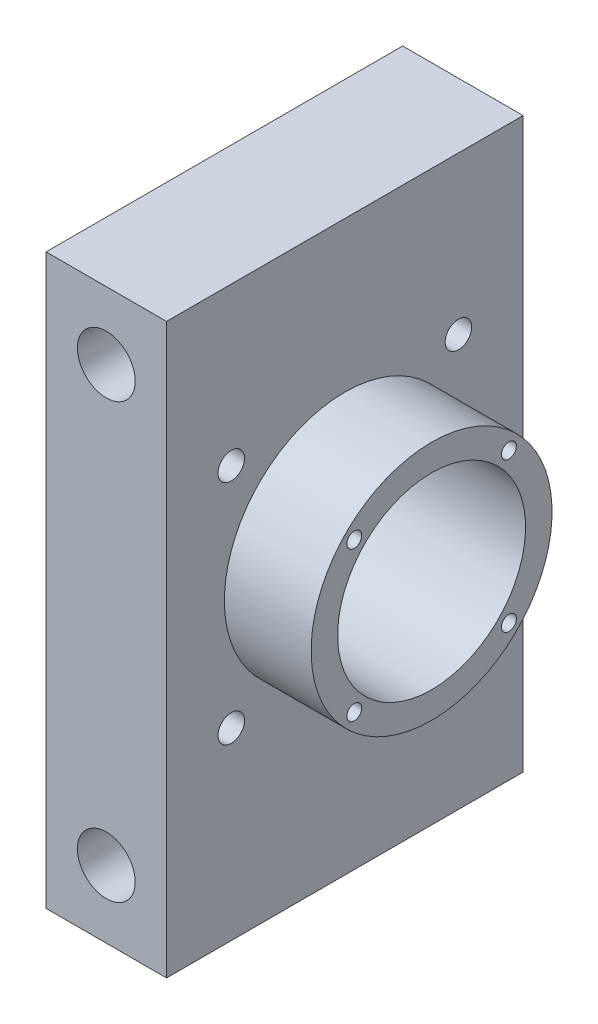
ISO-10303-21;
HEADER;
FILE_DESCRIPTION(('STEP AP214'),'2;1');
FILE_NAME('part.step','',(''),(''),'','','');
FILE_SCHEMA(('AUTOMOTIVE_DESIGN { 1 0 10303 214 1 1 1 1 }'));
ENDSEC;
DATA;
#1=APPLICATION_CONTEXT('core data for automotive mechanical design processes');
#2=APPLICATION_PROTOCOL_DEFINITION('international standard','automotive_design',2000,#1);
#3=PRODUCT_CONTEXT('',#1,'mechanical');
#4=PRODUCT('Part','Part','',(#3));
#5=PRODUCT_RELATED_PRODUCT_CATEGORY('part','',(#4));
#6=PRODUCT_DEFINITION_FORMATION('','',#4);
#7=PRODUCT_DEFINITION_CONTEXT('part definition',#1,'design');
#8=PRODUCT_DEFINITION('design','',#6,#7);
#9=PRODUCT_DEFINITION_SHAPE('','',#8);
#10=(LENGTH_UNIT() NAMED_UNIT(*) SI_UNIT(.MILLI.,.METRE.));
#11=(NAMED_UNIT(*) PLANE_ANGLE_UNIT() SI_UNIT($,.RADIAN.));
#12=(NAMED_UNIT(*) SI_UNIT($,.STERADIAN.) SOLID_ANGLE_UNIT());
#13=UNCERTAINTY_MEASURE_WITH_UNIT(LENGTH_MEASURE(1.E-05),#10,'distance_accuracy_value','');
#14=(GEOMETRIC_REPRESENTATION_CONTEXT(3) GLOBAL_UNCERTAINTY_ASSIGNED_CONTEXT((#13)) GLOBAL_UNIT_ASSIGNED_CONTEXT((#10,
#11,#12)) REPRESENTATION_CONTEXT('',''));
#15=CARTESIAN_POINT('',(0.,0.,0.));
#16=DIRECTION('',(0.,0.,1.));
#17=DIRECTION('',(1.,0.,0.));
#18=AXIS2_PLACEMENT_3D('',#15,#16,#17);
#19=CARTESIAN_POINT('',(0.,100.,320.));
#20=DIRECTION('',(-1.,0.,0.));
#21=DIRECTION('',(0.,-1.,0.));
#22=AXIS2_PLACEMENT_3D('',#19,#20,#21);
#23=PLANE('',#22);
#24=CARTESIAN_POINT('',(0.,76.3639430257798,-1.43000000000002));
#25=DIRECTION('',(-1.,0.,0.));
#26=DIRECTION('',(0.,-1.,0.));
#27=AXIS2_PLACEMENT_3D('',#24,#25,#26);
#28=CIRCLE('',#27,2.75);
#29=CARTESIAN_POINT('',(0.,73.6139430257798,-1.43000000000002));
#30=VERTEX_POINT('',#29);
#31=EDGE_CURVE('E186',#30,#30,#28,.T.);
#32=ORIENTED_EDGE('',*,*,#31,.T.);
#33=EDGE_LOOP('',(#32));
#34=FACE_BOUND('',#33,.T.);
#35=CARTESIAN_POINT('',(0.,29.2239430257798,-1.43000000000001));
#36=DIRECTION('',(-1.,0.,0.));
#37=DIRECTION('',(0.,-1.,0.));
#38=AXIS2_PLACEMENT_3D('',#35,#36,#37);
#39=CIRCLE('',#38,2.75);
#40=CARTESIAN_POINT('',(0.,26.4739430257798,-1.43000000000001));
#41=VERTEX_POINT('',#40);
#42=EDGE_CURVE('E183',#41,#41,#39,.T.);
#43=ORIENTED_EDGE('',*,*,#42,.T.);
#44=EDGE_LOOP('',(#43));
#45=FACE_BOUND('',#44,.T.);
#46=CARTESIAN_POINT('',(0.,29.2239430257798,-48.57));
#47=DIRECTION('',(-1.,0.,0.));
#48=DIRECTION('',(0.,-1.,0.));
#49=AXIS2_PLACEMENT_3D('',#46,#47,#48);
#50=CIRCLE('',#49,2.75);
#51=CARTESIAN_POINT('',(0.,26.4739430257798,-48.57));
#52=VERTEX_POINT('',#51);
#53=EDGE_CURVE('E180',#52,#52,#50,.T.);
#54=ORIENTED_EDGE('',*,*,#53,.T.);
#55=EDGE_LOOP('',(#54));
#56=FACE_BOUND('',#55,.T.);
#57=CARTESIAN_POINT('',(0.,76.3639430257798,-48.57));
#58=DIRECTION('',(-1.,0.,0.));
#59=DIRECTION('',(0.,-1.,0.));
#60=AXIS2_PLACEMENT_3D('',#57,#58,#59);
#61=CIRCLE('',#60,2.75);
#62=CARTESIAN_POINT('',(0.,73.6139430257798,-48.57));
#63=VERTEX_POINT('',#62);
#64=EDGE_CURVE('E189',#63,#63,#61,.T.);
#65=ORIENTED_EDGE('',*,*,#64,.T.);
#66=EDGE_LOOP('',(#65));
#67=FACE_BOUND('',#66,.T.);
#68=DIRECTION('',(0.,0.,1.));
#69=VECTOR('',#68,1.);
#70=CARTESIAN_POINT('',(0.,-9.00000000000001,-75.3179778023445));
#71=LINE('',#70,#69);
#72=CARTESIAN_POINT('',(0.,-9.00000000000001,-62.));
#73=VERTEX_POINT('',#72);
#74=CARTESIAN_POINT('',(0.,-9.,12.));
#75=VERTEX_POINT('',#74);
#76=EDGE_CURVE('E230',#73,#75,#71,.T.);
#77=ORIENTED_EDGE('',*,*,#76,.F.);
#78=DIRECTION('',(0.,1.,0.));
#79=VECTOR('',#78,1.);
#80=CARTESIAN_POINT('',(0.,109.,-62.));
#81=LINE('',#80,#79);
#82=CARTESIAN_POINT('',(0.,109.,-62.));
#83=VERTEX_POINT('',#82);
#84=EDGE_CURVE('E196',#73,#83,#81,.T.);
#85=ORIENTED_EDGE('',*,*,#84,.T.);
#86=DIRECTION('',(0.,0.,1.));
#87=VECTOR('',#86,1.);
#88=CARTESIAN_POINT('',(0.,109.,-75.3179778023445));
#89=LINE('',#88,#87);
#90=CARTESIAN_POINT('',(0.,109.,12.));
#91=VERTEX_POINT('',#90);
#92=EDGE_CURVE('E62',#83,#91,#89,.T.);
#93=ORIENTED_EDGE('',*,*,#92,.T.);
#94=DIRECTION('',(0.,-1.,0.));
#95=VECTOR('',#94,1.);
#96=CARTESIAN_POINT('',(0.,109.,12.));
#97=LINE('',#96,#95);
#98=EDGE_CURVE('E207',#91,#75,#97,.T.);
#99=ORIENTED_EDGE('',*,*,#98,.T.);
#100=EDGE_LOOP('',(#77,#85,#93,#99));
#101=FACE_BOUND('',#100,.T.);
#102=CARTESIAN_POINT('',(0.,52.7939430257798,-25.));
#103=DIRECTION('',(1.,0.,0.));
#104=DIRECTION('',(0.,1.,0.));
#105=AXIS2_PLACEMENT_3D('',#102,#103,#104);
#106=CIRCLE('',#105,25.);
#107=CARTESIAN_POINT('',(0.,77.7939430257798,-25.));
#108=VERTEX_POINT('',#107);
#109=EDGE_CURVE('E46',#108,#108,#106,.T.);
#110=ORIENTED_EDGE('',*,*,#109,.F.);
#111=EDGE_LOOP('',(#110));
#112=FACE_BOUND('',#111,.T.);
#113=ADVANCED_FACE('F38',(#34,#45,#56,#67,#101,#112),#23,.F.);
#114=CARTESIAN_POINT('',(-25.,100.,320.));
#115=DIRECTION('',(1.,0.,0.));
#116=DIRECTION('',(0.,1.,0.));
#117=AXIS2_PLACEMENT_3D('',#114,#115,#116);
#118=PLANE('',#117);
#119=DIRECTION('',(0.,0.,-1.));
#120=VECTOR('',#119,1.);
#121=CARTESIAN_POINT('',(-25.,81.5439430257798,-53.75));
#122=LINE('',#121,#120);
#123=CARTESIAN_POINT('',(-25.,81.5439430257798,3.75000000000003));
#124=VERTEX_POINT('',#123);
#125=CARTESIAN_POINT('',(-25.,81.5439430257798,-53.75));
#126=VERTEX_POINT('',#125);
#127=EDGE_CURVE('E156',#124,#126,#122,.T.);
#128=ORIENTED_EDGE('',*,*,#127,.F.);
#129=DIRECTION('',(0.,1.,0.));
#130=VECTOR('',#129,1.);
#131=CARTESIAN_POINT('',(-25.,24.0439430257797,3.74999999999999));
#132=LINE('',#131,#130);
#133=CARTESIAN_POINT('',(-25.,24.0439430257797,3.74999999999999));
#134=VERTEX_POINT('',#133);
#135=EDGE_CURVE('E54',#134,#124,#132,.T.);
#136=ORIENTED_EDGE('',*,*,#135,.F.);
#137=DIRECTION('',(0.,0.,1.));
#138=VECTOR('',#137,1.);
#139=CARTESIAN_POINT('',(-25.,24.0439430257797,-53.75));
#140=LINE('',#139,#138);
#141=CARTESIAN_POINT('',(-25.,24.0439430257797,-53.75));
#142=VERTEX_POINT('',#141);
#143=EDGE_CURVE('E113',#142,#134,#140,.T.);
#144=ORIENTED_EDGE('',*,*,#143,.F.);
#145=DIRECTION('',(0.,-1.,0.));
#146=VECTOR('',#145,1.);
#147=CARTESIAN_POINT('',(-25.,24.0439430257797,-53.75));
#148=LINE('',#147,#146);
#149=EDGE_CURVE('E158',#126,#142,#148,.T.);
#150=ORIENTED_EDGE('',*,*,#149,.F.);
#151=EDGE_LOOP('',(#128,#136,#144,#150));
#152=FACE_BOUND('',#151,.T.);
#153=DIRECTION('',(0.,0.,1.));
#154=VECTOR('',#153,1.);
#155=CARTESIAN_POINT('',(-25.0000000000002,-9.00000000000001,-75.3179778023445));
#156=LINE('',#155,#154);
#157=CARTESIAN_POINT('',(-25.,-9.00000000000001,-62.));
#158=VERTEX_POINT('',#157);
#159=CARTESIAN_POINT('',(-25.,-9.00000000000001,12.));
#160=VERTEX_POINT('',#159);
#161=EDGE_CURVE('E229',#158,#160,#156,.T.);
#162=ORIENTED_EDGE('',*,*,#161,.T.);
#163=DIRECTION('',(0.,1.,0.));
#164=VECTOR('',#163,1.);
#165=CARTESIAN_POINT('',(-25.,109.,12.));
#166=LINE('',#165,#164);
#167=CARTESIAN_POINT('',(-25.,109.,12.));
#168=VERTEX_POINT('',#167);
#169=EDGE_CURVE('E198',#160,#168,#166,.T.);
#170=ORIENTED_EDGE('',*,*,#169,.T.);
#171=DIRECTION('',(0.,0.,1.));
#172=VECTOR('',#171,1.);
#173=CARTESIAN_POINT('',(-25.0000000000002,109.,-75.3179778023445));
#174=LINE('',#173,#172);
#175=CARTESIAN_POINT('',(-25.,109.,-62.));
#176=VERTEX_POINT('',#175);
#177=EDGE_CURVE('E233',#176,#168,#174,.T.);
#178=ORIENTED_EDGE('',*,*,#177,.F.);
#179=DIRECTION('',(0.,-1.,0.));
#180=VECTOR('',#179,1.);
#181=CARTESIAN_POINT('',(-25.,109.,-62.));
#182=LINE('',#181,#180);
#183=EDGE_CURVE('E195',#176,#158,#182,.T.);
#184=ORIENTED_EDGE('',*,*,#183,.T.);
#185=EDGE_LOOP('',(#162,#170,#178,#184));
#186=FACE_BOUND('',#185,.T.);
#187=ADVANCED_FACE('F242',(#152,#186),#118,.F.);
#188=CARTESIAN_POINT('',(18.,52.7939430257798,-25.));
#189=DIRECTION('',(1.,0.,0.));
#190=DIRECTION('',(0.,1.,0.));
#191=AXIS2_PLACEMENT_3D('',#188,#189,#190);
#192=PLANE('',#191);
#193=CARTESIAN_POINT('',(18.,52.7939430257798,-25.));
#194=DIRECTION('',(-1.,0.,0.));
#195=DIRECTION('',(0.,-1.,0.));
#196=AXIS2_PLACEMENT_3D('',#193,#194,#195);
#197=CIRCLE('',#196,19.5);
#198=CARTESIAN_POINT('',(18.,33.2939430257798,-25.));
#199=VERTEX_POINT('',#198);
#200=EDGE_CURVE('E192',#199,#199,#197,.T.);
#201=ORIENTED_EDGE('',*,*,#200,.T.);
#202=EDGE_LOOP('',(#201));
#203=FACE_BOUND('',#202,.T.);
#204=CARTESIAN_POINT('',(18.,68.2939430257798,-8.95466243610082));
#205=DIRECTION('',(-1.,0.,0.));
#206=DIRECTION('',(0.,-1.,0.));
#207=AXIS2_PLACEMENT_3D('',#204,#205,#206);
#208=CIRCLE('',#207,1.55);
#209=CARTESIAN_POINT('',(18.,66.7439430257798,-8.95466243610082));
#210=VERTEX_POINT('',#209);
#211=EDGE_CURVE('E218',#210,#210,#208,.T.);
#212=ORIENTED_EDGE('',*,*,#211,.T.);
#213=EDGE_LOOP('',(#212));
#214=FACE_BOUND('',#213,.T.);
#215=CARTESIAN_POINT('',(18.,37.2939430257798,-8.95466243610082));
#216=DIRECTION('',(-1.,0.,0.));
#217=DIRECTION('',(0.,-1.,0.));
#218=AXIS2_PLACEMENT_3D('',#215,#216,#217);
#219=CIRCLE('',#218,1.55);
#220=CARTESIAN_POINT('',(18.,35.7439430257798,-8.95466243610082));
#221=VERTEX_POINT('',#220);
#222=EDGE_CURVE('E222',#221,#221,#219,.T.);
#223=ORIENTED_EDGE('',*,*,#222,.T.);
#224=EDGE_LOOP('',(#223));
#225=FACE_BOUND('',#224,.T.);
#226=CARTESIAN_POINT('',(18.,37.2939430257798,-41.0453375638992));
#227=DIRECTION('',(-1.,0.,0.));
#228=DIRECTION('',(0.,-1.,0.));
#229=AXIS2_PLACEMENT_3D('',#226,#227,#228);
#230=CIRCLE('',#229,1.55);
#231=CARTESIAN_POINT('',(18.,35.7439430257798,-41.0453375638992));
#232=VERTEX_POINT('',#231);
#233=EDGE_CURVE('E209',#232,#232,#230,.T.);
#234=ORIENTED_EDGE('',*,*,#233,.T.);
#235=EDGE_LOOP('',(#234));
#236=FACE_BOUND('',#235,.T.);
#237=CARTESIAN_POINT('',(18.,68.2939430257798,-41.0453375638992));
#238=DIRECTION('',(-1.,0.,0.));
#239=DIRECTION('',(0.,-1.,0.));
#240=AXIS2_PLACEMENT_3D('',#237,#238,#239);
#241=CIRCLE('',#240,1.55);
#242=CARTESIAN_POINT('',(18.,66.7439430257798,-41.0453375638992));
#243=VERTEX_POINT('',#242);
#244=EDGE_CURVE('E221',#243,#243,#241,.T.);
#245=ORIENTED_EDGE('',*,*,#244,.T.);
#246=EDGE_LOOP('',(#245));
#247=FACE_BOUND('',#246,.T.);
#248=CARTESIAN_POINT('',(18.,52.7939430257798,-25.));
#249=DIRECTION('',(1.,0.,0.));
#250=DIRECTION('',(0.,1.,0.));
#251=AXIS2_PLACEMENT_3D('',#248,#249,#250);
#252=CIRCLE('',#251,25.);
#253=CARTESIAN_POINT('',(18.,77.7939430257798,-25.));
#254=VERTEX_POINT('',#253);
#255=EDGE_CURVE('E12',#254,#254,#252,.T.);
#256=ORIENTED_EDGE('',*,*,#255,.T.);
#257=EDGE_LOOP('',(#256));
#258=FACE_BOUND('',#257,.T.);
#259=ADVANCED_FACE('F249',(#203,#214,#225,#236,#247,#258),#192,.T.);
#260=CARTESIAN_POINT('',(18.,52.7939430257798,-25.));
#261=DIRECTION('',(-1.,0.,0.));
#262=DIRECTION('',(0.,-1.,0.));
#263=AXIS2_PLACEMENT_3D('',#260,#261,#262);
#264=CYLINDRICAL_SURFACE('',#263,25.);
#265=ORIENTED_EDGE('',*,*,#109,.T.);
#266=EDGE_LOOP('',(#265));
#267=FACE_BOUND('',#266,.T.);
#268=ORIENTED_EDGE('',*,*,#255,.F.);
#269=EDGE_LOOP('',(#268));
#270=FACE_BOUND('',#269,.T.);
#271=ADVANCED_FACE('F238',(#267,#270),#264,.T.);
#272=CARTESIAN_POINT('',(-25.0000000000002,109.,-75.3179778023445));
#273=DIRECTION('',(0.,1.,0.));
#274=DIRECTION('',(0.,0.,1.));
#275=AXIS2_PLACEMENT_3D('',#272,#273,#274);
#276=PLANE('',#275);
#277=ORIENTED_EDGE('',*,*,#92,.F.);
#278=DIRECTION('',(-1.,0.,0.));
#279=VECTOR('',#278,1.);
#280=CARTESIAN_POINT('',(118.608600025462,109.,-62.));
#281=LINE('',#280,#279);
#282=EDGE_CURVE('E202',#83,#176,#281,.T.);
#283=ORIENTED_EDGE('',*,*,#282,.T.);
#284=ORIENTED_EDGE('',*,*,#177,.T.);
#285=DIRECTION('',(-1.,0.,0.));
#286=VECTOR('',#285,1.);
#287=CARTESIAN_POINT('',(118.608600025462,109.,12.));
#288=LINE('',#287,#286);
#289=EDGE_CURVE('E210',#91,#168,#288,.T.);
#290=ORIENTED_EDGE('',*,*,#289,.F.);
#291=EDGE_LOOP('',(#277,#283,#284,#290));
#292=FACE_BOUND('',#291,.T.);
#293=ADVANCED_FACE('F271',(#292),#276,.T.);
#294=CARTESIAN_POINT('',(-25.0000000000002,-9.00000000000001,-75.3179778023445));
#295=DIRECTION('',(0.,-1.,0.));
#296=DIRECTION('',(0.,0.,-1.));
#297=AXIS2_PLACEMENT_3D('',#294,#295,#296);
#298=PLANE('',#297);
#299=ORIENTED_EDGE('',*,*,#161,.F.);
#300=DIRECTION('',(-1.,0.,0.));
#301=VECTOR('',#300,1.);
#302=CARTESIAN_POINT('',(118.608600025462,-9.,-62.));
#303=LINE('',#302,#301);
#304=EDGE_CURVE('E199',#73,#158,#303,.T.);
#305=ORIENTED_EDGE('',*,*,#304,.F.);
#306=ORIENTED_EDGE('',*,*,#76,.T.);
#307=DIRECTION('',(-1.,0.,0.));
#308=VECTOR('',#307,1.);
#309=CARTESIAN_POINT('',(118.608600025462,-8.99999999999999,12.));
#310=LINE('',#309,#308);
#311=EDGE_CURVE('E213',#75,#160,#310,.T.);
#312=ORIENTED_EDGE('',*,*,#311,.T.);
#313=EDGE_LOOP('',(#299,#305,#306,#312));
#314=FACE_BOUND('',#313,.T.);
#315=ADVANCED_FACE('F266',(#314),#298,.T.);
#316=CARTESIAN_POINT('',(18.,68.2939430257798,-41.0453375638992));
#317=DIRECTION('',(-1.,0.,0.));
#318=DIRECTION('',(0.,-1.,0.));
#319=AXIS2_PLACEMENT_3D('',#316,#317,#318);
#320=CYLINDRICAL_SURFACE('',#319,1.55);
#321=CARTESIAN_POINT('',(-9.99999999999999,68.2939430257798,-41.0453375638992));
#322=DIRECTION('',(1.,0.,0.));
#323=DIRECTION('',(0.,1.,0.));
#324=AXIS2_PLACEMENT_3D('',#321,#322,#323);
#325=CIRCLE('',#324,1.55);
#326=CARTESIAN_POINT('',(-9.99999999999999,69.8439430257798,-41.0453375638992));
#327=VERTEX_POINT('',#326);
#328=EDGE_CURVE('E152',#327,#327,#325,.F.);
#329=ORIENTED_EDGE('',*,*,#328,.T.);
#330=EDGE_LOOP('',(#329));
#331=FACE_BOUND('',#330,.T.);
#332=ORIENTED_EDGE('',*,*,#244,.F.);
#333=EDGE_LOOP('',(#332));
#334=FACE_BOUND('',#333,.T.);
#335=ADVANCED_FACE('F307',(#331,#334),#320,.F.);
#336=CARTESIAN_POINT('',(18.,37.2939430257798,-41.0453375638992));
#337=DIRECTION('',(-1.,0.,0.));
#338=DIRECTION('',(0.,-1.,0.));
#339=AXIS2_PLACEMENT_3D('',#336,#337,#338);
#340=CYLINDRICAL_SURFACE('',#339,1.55);
#341=CARTESIAN_POINT('',(-9.99999999999999,37.2939430257798,-41.0453375638992));
#342=DIRECTION('',(1.,0.,0.));
#343=DIRECTION('',(0.,1.,0.));
#344=AXIS2_PLACEMENT_3D('',#341,#342,#343);
#345=CIRCLE('',#344,1.55);
#346=CARTESIAN_POINT('',(-9.99999999999999,38.8439430257798,-41.0453375638992));
#347=VERTEX_POINT('',#346);
#348=EDGE_CURVE('E149',#347,#347,#345,.F.);
#349=ORIENTED_EDGE('',*,*,#348,.T.);
#350=EDGE_LOOP('',(#349));
#351=FACE_BOUND('',#350,.T.);
#352=ORIENTED_EDGE('',*,*,#233,.F.);
#353=EDGE_LOOP('',(#352));
#354=FACE_BOUND('',#353,.T.);
#355=ADVANCED_FACE('F303',(#351,#354),#340,.F.);
#356=CARTESIAN_POINT('',(18.,37.2939430257798,-8.95466243610082));
#357=DIRECTION('',(-1.,0.,0.));
#358=DIRECTION('',(0.,-1.,0.));
#359=AXIS2_PLACEMENT_3D('',#356,#357,#358);
#360=CYLINDRICAL_SURFACE('',#359,1.55);
#361=CARTESIAN_POINT('',(-9.99999999999999,37.2939430257798,-8.95466243610082));
#362=DIRECTION('',(1.,0.,0.));
#363=DIRECTION('',(0.,1.,0.));
#364=AXIS2_PLACEMENT_3D('',#361,#362,#363);
#365=CIRCLE('',#364,1.55);
#366=CARTESIAN_POINT('',(-9.99999999999999,38.8439430257798,-8.95466243610082));
#367=VERTEX_POINT('',#366);
#368=EDGE_CURVE('E146',#367,#367,#365,.F.);
#369=ORIENTED_EDGE('',*,*,#368,.T.);
#370=EDGE_LOOP('',(#369));
#371=FACE_BOUND('',#370,.T.);
#372=ORIENTED_EDGE('',*,*,#222,.F.);
#373=EDGE_LOOP('',(#372));
#374=FACE_BOUND('',#373,.T.);
#375=ADVANCED_FACE('F285',(#371,#374),#360,.F.);
#376=CARTESIAN_POINT('',(18.,68.2939430257798,-8.95466243610082));
#377=DIRECTION('',(-1.,0.,0.));
#378=DIRECTION('',(0.,-1.,0.));
#379=AXIS2_PLACEMENT_3D('',#376,#377,#378);
#380=CYLINDRICAL_SURFACE('',#379,1.55);
#381=CARTESIAN_POINT('',(-9.99999999999999,68.2939430257798,-8.95466243610082));
#382=DIRECTION('',(1.,0.,0.));
#383=DIRECTION('',(0.,1.,0.));
#384=AXIS2_PLACEMENT_3D('',#381,#382,#383);
#385=CIRCLE('',#384,1.55);
#386=CARTESIAN_POINT('',(-9.99999999999999,69.8439430257798,-8.95466243610082));
#387=VERTEX_POINT('',#386);
#388=EDGE_CURVE('E143',#387,#387,#385,.F.);
#389=ORIENTED_EDGE('',*,*,#388,.T.);
#390=EDGE_LOOP('',(#389));
#391=FACE_BOUND('',#390,.T.);
#392=ORIENTED_EDGE('',*,*,#211,.F.);
#393=EDGE_LOOP('',(#392));
#394=FACE_BOUND('',#393,.T.);
#395=ADVANCED_FACE('F275',(#391,#394),#380,.F.);
#396=CARTESIAN_POINT('',(118.608600025462,109.,12.));
#397=DIRECTION('',(0.,0.,1.));
#398=DIRECTION('',(0.,-1.,0.));
#399=AXIS2_PLACEMENT_3D('',#396,#397,#398);
#400=PLANE('',#399);
#401=CARTESIAN_POINT('',(-12.5,5.,12.));
#402=DIRECTION('',(0.,0.,1.));
#403=DIRECTION('',(0.,-1.,0.));
#404=AXIS2_PLACEMENT_3D('',#401,#402,#403);
#405=CIRCLE('',#404,6.);
#406=CARTESIAN_POINT('',(-12.5,-1.,12.));
#407=VERTEX_POINT('',#406);
#408=EDGE_CURVE('E171',#407,#407,#405,.T.);
#409=ORIENTED_EDGE('',*,*,#408,.F.);
#410=EDGE_LOOP('',(#409));
#411=FACE_BOUND('',#410,.T.);
#412=CARTESIAN_POINT('',(-12.5,95.,12.));
#413=DIRECTION('',(0.,0.,1.));
#414=DIRECTION('',(0.,-1.,0.));
#415=AXIS2_PLACEMENT_3D('',#412,#413,#414);
#416=CIRCLE('',#415,6.);
#417=CARTESIAN_POINT('',(-12.5,89.,12.));
#418=VERTEX_POINT('',#417);
#419=EDGE_CURVE('E177',#418,#418,#416,.T.);
#420=ORIENTED_EDGE('',*,*,#419,.F.);
#421=EDGE_LOOP('',(#420));
#422=FACE_BOUND('',#421,.T.);
#423=ORIENTED_EDGE('',*,*,#98,.F.);
#424=ORIENTED_EDGE('',*,*,#289,.T.);
#425=ORIENTED_EDGE('',*,*,#169,.F.);
#426=ORIENTED_EDGE('',*,*,#311,.F.);
#427=EDGE_LOOP('',(#423,#424,#425,#426));
#428=FACE_BOUND('',#427,.T.);
#429=ADVANCED_FACE('F273',(#411,#422,#428),#400,.T.);
#430=CARTESIAN_POINT('',(118.608600025462,109.,-62.));
#431=DIRECTION('',(0.,0.,-1.));
#432=DIRECTION('',(0.,1.,0.));
#433=AXIS2_PLACEMENT_3D('',#430,#431,#432);
#434=PLANE('',#433);
#435=CARTESIAN_POINT('',(-12.5,5.,-62.));
#436=DIRECTION('',(0.,0.,1.));
#437=DIRECTION('',(1.,0.,0.));
#438=AXIS2_PLACEMENT_3D('',#435,#436,#437);
#439=CIRCLE('',#438,6.);
#440=CARTESIAN_POINT('',(-6.49999999999999,5.,-62.));
#441=VERTEX_POINT('',#440);
#442=EDGE_CURVE('E165',#441,#441,#439,.T.);
#443=ORIENTED_EDGE('',*,*,#442,.T.);
#444=EDGE_LOOP('',(#443));
#445=FACE_BOUND('',#444,.T.);
#446=CARTESIAN_POINT('',(-12.5,95.,-62.));
#447=DIRECTION('',(0.,0.,1.));
#448=DIRECTION('',(1.,0.,0.));
#449=AXIS2_PLACEMENT_3D('',#446,#447,#448);
#450=CIRCLE('',#449,6.);
#451=CARTESIAN_POINT('',(-6.5,95.,-62.));
#452=VERTEX_POINT('',#451);
#453=EDGE_CURVE('E174',#452,#452,#450,.T.);
#454=ORIENTED_EDGE('',*,*,#453,.T.);
#455=EDGE_LOOP('',(#454));
#456=FACE_BOUND('',#455,.T.);
#457=ORIENTED_EDGE('',*,*,#84,.F.);
#458=ORIENTED_EDGE('',*,*,#304,.T.);
#459=ORIENTED_EDGE('',*,*,#183,.F.);
#460=ORIENTED_EDGE('',*,*,#282,.F.);
#461=EDGE_LOOP('',(#457,#458,#459,#460));
#462=FACE_BOUND('',#461,.T.);
#463=ADVANCED_FACE('F264',(#445,#456,#462),#434,.T.);
#464=CARTESIAN_POINT('',(18.,52.7939430257798,-25.));
#465=DIRECTION('',(-1.,0.,0.));
#466=DIRECTION('',(0.,-1.,0.));
#467=AXIS2_PLACEMENT_3D('',#464,#465,#466);
#468=CYLINDRICAL_SURFACE('',#467,19.5);
#469=CARTESIAN_POINT('',(-9.99999999999999,52.7939430257798,-25.));
#470=DIRECTION('',(1.,0.,0.));
#471=DIRECTION('',(0.,1.,0.));
#472=AXIS2_PLACEMENT_3D('',#469,#470,#471);
#473=CIRCLE('',#472,19.5);
#474=CARTESIAN_POINT('',(-9.99999999999999,72.2939430257798,-25.));
#475=VERTEX_POINT('',#474);
#476=EDGE_CURVE('E140',#475,#475,#473,.F.);
#477=ORIENTED_EDGE('',*,*,#476,.T.);
#478=EDGE_LOOP('',(#477));
#479=FACE_BOUND('',#478,.T.);
#480=ORIENTED_EDGE('',*,*,#200,.F.);
#481=EDGE_LOOP('',(#480));
#482=FACE_BOUND('',#481,.T.);
#483=ADVANCED_FACE('F281',(#479,#482),#468,.F.);
#484=CARTESIAN_POINT('',(18.,76.3639430257798,-48.57));
#485=DIRECTION('',(-1.,0.,0.));
#486=DIRECTION('',(0.,-1.,0.));
#487=AXIS2_PLACEMENT_3D('',#484,#485,#486);
#488=CYLINDRICAL_SURFACE('',#487,2.75);
#489=CARTESIAN_POINT('',(-9.99999999999999,76.3639430257798,-48.57));
#490=DIRECTION('',(1.,0.,0.));
#491=DIRECTION('',(0.,1.,0.));
#492=AXIS2_PLACEMENT_3D('',#489,#490,#491);
#493=CIRCLE('',#492,2.75);
#494=CARTESIAN_POINT('',(-9.99999999999999,79.1139430257798,-48.57));
#495=VERTEX_POINT('',#494);
#496=EDGE_CURVE('E137',#495,#495,#493,.F.);
#497=ORIENTED_EDGE('',*,*,#496,.T.);
#498=EDGE_LOOP('',(#497));
#499=FACE_BOUND('',#498,.T.);
#500=ORIENTED_EDGE('',*,*,#64,.F.);
#501=EDGE_LOOP('',(#500));
#502=FACE_BOUND('',#501,.T.);
#503=ADVANCED_FACE('F550',(#499,#502),#488,.F.);
#504=CARTESIAN_POINT('',(18.,29.2239430257798,-48.57));
#505=DIRECTION('',(-1.,0.,0.));
#506=DIRECTION('',(0.,-1.,0.));
#507=AXIS2_PLACEMENT_3D('',#504,#505,#506);
#508=CYLINDRICAL_SURFACE('',#507,2.75);
#509=CARTESIAN_POINT('',(-9.99999999999999,29.2239430257798,-48.57));
#510=DIRECTION('',(1.,0.,0.));
#511=DIRECTION('',(0.,1.,0.));
#512=AXIS2_PLACEMENT_3D('',#509,#510,#511);
#513=CIRCLE('',#512,2.75);
#514=CARTESIAN_POINT('',(-9.99999999999999,31.9739430257798,-48.57));
#515=VERTEX_POINT('',#514);
#516=EDGE_CURVE('E134',#515,#515,#513,.F.);
#517=ORIENTED_EDGE('',*,*,#516,.T.);
#518=EDGE_LOOP('',(#517));
#519=FACE_BOUND('',#518,.T.);
#520=ORIENTED_EDGE('',*,*,#53,.F.);
#521=EDGE_LOOP('',(#520));
#522=FACE_BOUND('',#521,.T.);
#523=ADVANCED_FACE('F540',(#519,#522),#508,.F.);
#524=CARTESIAN_POINT('',(18.,29.2239430257798,-1.43000000000001));
#525=DIRECTION('',(-1.,0.,0.));
#526=DIRECTION('',(0.,-1.,0.));
#527=AXIS2_PLACEMENT_3D('',#524,#525,#526);
#528=CYLINDRICAL_SURFACE('',#527,2.75);
#529=CARTESIAN_POINT('',(-9.99999999999999,29.2239430257798,-1.43000000000001));
#530=DIRECTION('',(1.,0.,0.));
#531=DIRECTION('',(0.,1.,0.));
#532=AXIS2_PLACEMENT_3D('',#529,#530,#531);
#533=CIRCLE('',#532,2.75);
#534=CARTESIAN_POINT('',(-9.99999999999999,31.9739430257798,-1.43000000000001));
#535=VERTEX_POINT('',#534);
#536=EDGE_CURVE('E131',#535,#535,#533,.F.);
#537=ORIENTED_EDGE('',*,*,#536,.T.);
#538=EDGE_LOOP('',(#537));
#539=FACE_BOUND('',#538,.T.);
#540=ORIENTED_EDGE('',*,*,#42,.F.);
#541=EDGE_LOOP('',(#540));
#542=FACE_BOUND('',#541,.T.);
#543=ADVANCED_FACE('F530',(#539,#542),#528,.F.);
#544=CARTESIAN_POINT('',(18.,76.3639430257798,-1.43000000000002));
#545=DIRECTION('',(-1.,0.,0.));
#546=DIRECTION('',(0.,-1.,0.));
#547=AXIS2_PLACEMENT_3D('',#544,#545,#546);
#548=CYLINDRICAL_SURFACE('',#547,2.75);
#549=CARTESIAN_POINT('',(-9.99999999999999,76.3639430257798,-1.43000000000002));
#550=DIRECTION('',(1.,0.,0.));
#551=DIRECTION('',(0.,1.,0.));
#552=AXIS2_PLACEMENT_3D('',#549,#550,#551);
#553=CIRCLE('',#552,2.75);
#554=CARTESIAN_POINT('',(-9.99999999999999,79.1139430257798,-1.43000000000002));
#555=VERTEX_POINT('',#554);
#556=EDGE_CURVE('E41',#555,#555,#553,.F.);
#557=ORIENTED_EDGE('',*,*,#556,.T.);
#558=EDGE_LOOP('',(#557));
#559=FACE_BOUND('',#558,.T.);
#560=ORIENTED_EDGE('',*,*,#31,.F.);
#561=EDGE_LOOP('',(#560));
#562=FACE_BOUND('',#561,.T.);
#563=ADVANCED_FACE('F298',(#559,#562),#548,.F.);
#564=CARTESIAN_POINT('',(-12.5000000000001,95.,-50.));
#565=DIRECTION('',(0.,0.,1.));
#566=DIRECTION('',(1.,0.,0.));
#567=AXIS2_PLACEMENT_3D('',#564,#565,#566);
#568=CYLINDRICAL_SURFACE('',#567,6.);
#569=ORIENTED_EDGE('',*,*,#419,.T.);
#570=EDGE_LOOP('',(#569));
#571=FACE_BOUND('',#570,.T.);
#572=ORIENTED_EDGE('',*,*,#453,.F.);
#573=EDGE_LOOP('',(#572));
#574=FACE_BOUND('',#573,.T.);
#575=ADVANCED_FACE('F295',(#571,#574),#568,.F.);
#576=CARTESIAN_POINT('',(-12.5000000000001,4.99999999999999,-50.));
#577=DIRECTION('',(0.,0.,1.));
#578=DIRECTION('',(1.,0.,0.));
#579=AXIS2_PLACEMENT_3D('',#576,#577,#578);
#580=CYLINDRICAL_SURFACE('',#579,6.);
#581=ORIENTED_EDGE('',*,*,#408,.T.);
#582=EDGE_LOOP('',(#581));
#583=FACE_BOUND('',#582,.T.);
#584=ORIENTED_EDGE('',*,*,#442,.F.);
#585=EDGE_LOOP('',(#584));
#586=FACE_BOUND('',#585,.T.);
#587=ADVANCED_FACE('F292',(#583,#586),#580,.F.);
#588=CARTESIAN_POINT('',(66.317279836453,24.0439430257798,3.74999999999999));
#589=DIRECTION('',(0.,0.,1.));
#590=DIRECTION('',(1.,0.,0.));
#591=AXIS2_PLACEMENT_3D('',#588,#589,#590);
#592=PLANE('',#591);
#593=DIRECTION('',(-1.,0.,0.));
#594=VECTOR('',#593,1.);
#595=CARTESIAN_POINT('',(66.317279836453,81.5439430257798,3.74999999999999));
#596=LINE('',#595,#594);
#597=CARTESIAN_POINT('',(-10.,81.5439430257798,3.75000000000003));
#598=VERTEX_POINT('',#597);
#599=EDGE_CURVE('E103',#598,#124,#596,.T.);
#600=ORIENTED_EDGE('',*,*,#599,.F.);
#601=DIRECTION('',(0.,1.,0.));
#602=VECTOR('',#601,1.);
#603=CARTESIAN_POINT('',(-9.99999999999999,24.0439430257798,3.75000000000003));
#604=LINE('',#603,#602);
#605=CARTESIAN_POINT('',(-9.99999999999999,24.0439430257798,3.75000000000003));
#606=VERTEX_POINT('',#605);
#607=EDGE_CURVE('E107',#606,#598,#604,.T.);
#608=ORIENTED_EDGE('',*,*,#607,.F.);
#609=DIRECTION('',(-1.,0.,0.));
#610=VECTOR('',#609,1.);
#611=CARTESIAN_POINT('',(66.317279836453,24.0439430257798,3.74999999999999));
#612=LINE('',#611,#610);
#613=EDGE_CURVE('E163',#606,#134,#612,.T.);
#614=ORIENTED_EDGE('',*,*,#613,.T.);
#615=ORIENTED_EDGE('',*,*,#135,.T.);
#616=EDGE_LOOP('',(#600,#608,#614,#615));
#617=FACE_BOUND('',#616,.T.);
#618=ADVANCED_FACE('F105',(#617),#592,.F.);
#619=CARTESIAN_POINT('',(66.317279836453,24.0439430257798,-53.75));
#620=DIRECTION('',(0.,-1.,0.));
#621=DIRECTION('',(1.,0.,0.));
#622=AXIS2_PLACEMENT_3D('',#619,#620,#621);
#623=PLANE('',#622);
#624=ORIENTED_EDGE('',*,*,#613,.F.);
#625=DIRECTION('',(0.,0.,1.));
#626=VECTOR('',#625,1.);
#627=CARTESIAN_POINT('',(-9.99999999999999,24.0439430257798,-53.75));
#628=LINE('',#627,#626);
#629=CARTESIAN_POINT('',(-9.99999999999999,24.0439430257798,-53.75));
#630=VERTEX_POINT('',#629);
#631=EDGE_CURVE('E126',#630,#606,#628,.T.);
#632=ORIENTED_EDGE('',*,*,#631,.F.);
#633=DIRECTION('',(-1.,0.,0.));
#634=VECTOR('',#633,1.);
#635=CARTESIAN_POINT('',(66.317279836453,24.0439430257798,-53.75));
#636=LINE('',#635,#634);
#637=EDGE_CURVE('E166',#630,#142,#636,.T.);
#638=ORIENTED_EDGE('',*,*,#637,.T.);
#639=ORIENTED_EDGE('',*,*,#143,.T.);
#640=EDGE_LOOP('',(#624,#632,#638,#639));
#641=FACE_BOUND('',#640,.T.);
#642=ADVANCED_FACE('F472',(#641),#623,.F.);
#643=CARTESIAN_POINT('',(66.317279836453,24.0439430257798,-53.75));
#644=DIRECTION('',(0.,0.,-1.));
#645=DIRECTION('',(-1.,0.,0.));
#646=AXIS2_PLACEMENT_3D('',#643,#644,#645);
#647=PLANE('',#646);
#648=ORIENTED_EDGE('',*,*,#637,.F.);
#649=DIRECTION('',(0.,-1.,0.));
#650=VECTOR('',#649,1.);
#651=CARTESIAN_POINT('',(-9.99999999999999,24.0439430257798,-53.75));
#652=LINE('',#651,#650);
#653=CARTESIAN_POINT('',(-10.,81.5439430257798,-53.75));
#654=VERTEX_POINT('',#653);
#655=EDGE_CURVE('E121',#654,#630,#652,.T.);
#656=ORIENTED_EDGE('',*,*,#655,.F.);
#657=DIRECTION('',(-1.,0.,0.));
#658=VECTOR('',#657,1.);
#659=CARTESIAN_POINT('',(66.317279836453,81.5439430257798,-53.75));
#660=LINE('',#659,#658);
#661=EDGE_CURVE('E112',#654,#126,#660,.T.);
#662=ORIENTED_EDGE('',*,*,#661,.T.);
#663=ORIENTED_EDGE('',*,*,#149,.T.);
#664=EDGE_LOOP('',(#648,#656,#662,#663));
#665=FACE_BOUND('',#664,.T.);
#666=ADVANCED_FACE('F483',(#665),#647,.F.);
#667=CARTESIAN_POINT('',(66.317279836453,81.5439430257798,-53.75));
#668=DIRECTION('',(0.,1.,0.));
#669=DIRECTION('',(-1.,0.,0.));
#670=AXIS2_PLACEMENT_3D('',#667,#668,#669);
#671=PLANE('',#670);
#672=ORIENTED_EDGE('',*,*,#661,.F.);
#673=DIRECTION('',(0.,0.,-1.));
#674=VECTOR('',#673,1.);
#675=CARTESIAN_POINT('',(-10.,81.5439430257798,-53.75));
#676=LINE('',#675,#674);
#677=EDGE_CURVE('E116',#598,#654,#676,.T.);
#678=ORIENTED_EDGE('',*,*,#677,.F.);
#679=ORIENTED_EDGE('',*,*,#599,.T.);
#680=ORIENTED_EDGE('',*,*,#127,.T.);
#681=EDGE_LOOP('',(#672,#678,#679,#680));
#682=FACE_BOUND('',#681,.T.);
#683=ADVANCED_FACE('F117',(#682),#671,.F.);
#684=CARTESIAN_POINT('',(-9.99999999999998,0.,0.));
#685=DIRECTION('',(1.,0.,0.));
#686=DIRECTION('',(0.,1.,0.));
#687=AXIS2_PLACEMENT_3D('',#684,#685,#686);
#688=PLANE('',#687);
#689=ORIENTED_EDGE('',*,*,#348,.F.);
#690=EDGE_LOOP('',(#689));
#691=FACE_BOUND('',#690,.T.);
#692=ORIENTED_EDGE('',*,*,#388,.F.);
#693=EDGE_LOOP('',(#692));
#694=FACE_BOUND('',#693,.T.);
#695=ORIENTED_EDGE('',*,*,#496,.F.);
#696=EDGE_LOOP('',(#695));
#697=FACE_BOUND('',#696,.T.);
#698=ORIENTED_EDGE('',*,*,#536,.F.);
#699=EDGE_LOOP('',(#698));
#700=FACE_BOUND('',#699,.T.);
#701=ORIENTED_EDGE('',*,*,#607,.T.);
#702=ORIENTED_EDGE('',*,*,#677,.T.);
#703=ORIENTED_EDGE('',*,*,#655,.T.);
#704=ORIENTED_EDGE('',*,*,#631,.T.);
#705=EDGE_LOOP('',(#701,#702,#703,#704));
#706=FACE_BOUND('',#705,.T.);
#707=ORIENTED_EDGE('',*,*,#556,.F.);
#708=EDGE_LOOP('',(#707));
#709=FACE_BOUND('',#708,.T.);
#710=ORIENTED_EDGE('',*,*,#516,.F.);
#711=EDGE_LOOP('',(#710));
#712=FACE_BOUND('',#711,.T.);
#713=ORIENTED_EDGE('',*,*,#476,.F.);
#714=EDGE_LOOP('',(#713));
#715=FACE_BOUND('',#714,.T.);
#716=ORIENTED_EDGE('',*,*,#368,.F.);
#717=EDGE_LOOP('',(#716));
#718=FACE_BOUND('',#717,.T.);
#719=ORIENTED_EDGE('',*,*,#328,.F.);
#720=EDGE_LOOP('',(#719));
#721=FACE_BOUND('',#720,.T.);
#722=ADVANCED_FACE('F123',(#691,#694,#697,#700,#706,#709,#712,#715,#718,#721),#688,.F.);
#723=CLOSED_SHELL('',(#113,#187,#259,#271,#293,#315,#335,#355,#375,#395,#429,#463,#483,#503,
#523,#543,#563,#575,#587,#618,#642,#666,#683,#722));
#724=MANIFOLD_SOLID_BREP('B2',#723);
#725=ADVANCED_BREP_SHAPE_REPRESENTATION('',(#18,#724),#14);
#726=SHAPE_DEFINITION_REPRESENTATION(#9,#725);
ENDSEC;
END-ISO-10303-21;
